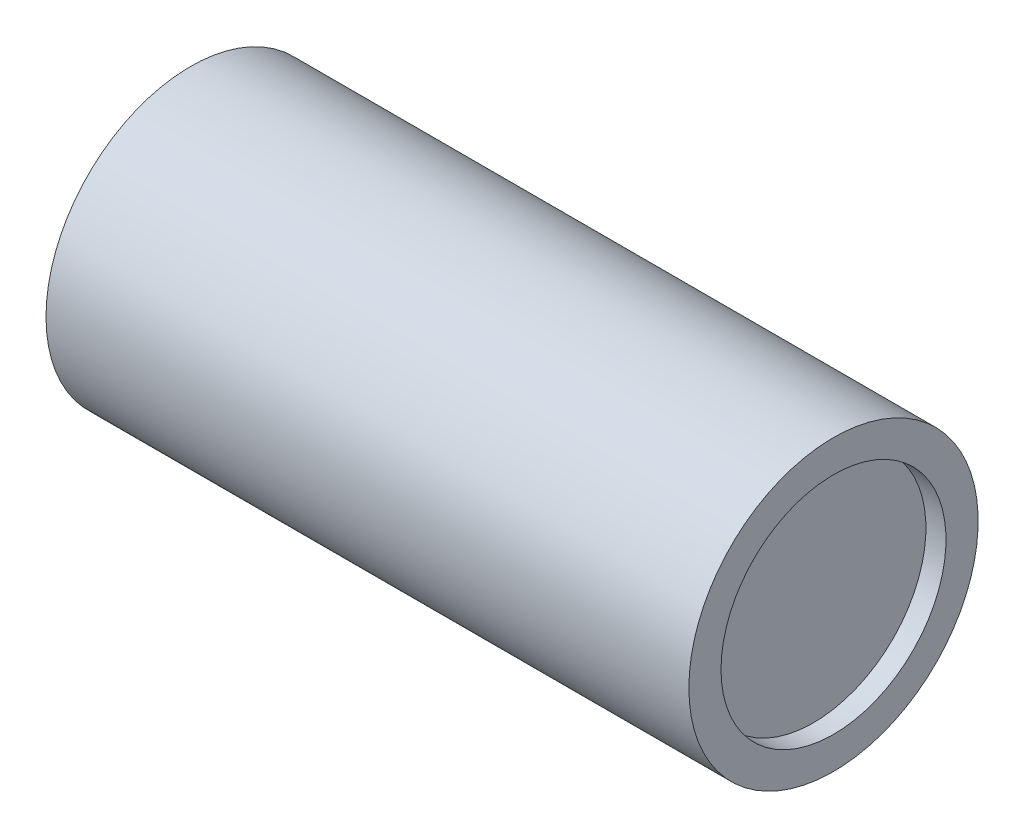
ISO-10303-21;
HEADER;
FILE_DESCRIPTION(('STEP AP214'),'2;1');
FILE_NAME('part.step','',(''),(''),'','','');
FILE_SCHEMA(('AUTOMOTIVE_DESIGN { 1 0 10303 214 1 1 1 1 }'));
ENDSEC;
DATA;
#1=APPLICATION_CONTEXT('core data for automotive mechanical design processes');
#2=APPLICATION_PROTOCOL_DEFINITION('international standard','automotive_design',2000,#1);
#3=PRODUCT_CONTEXT('',#1,'mechanical');
#4=PRODUCT('Part','Part','',(#3));
#5=PRODUCT_RELATED_PRODUCT_CATEGORY('part','',(#4));
#6=PRODUCT_DEFINITION_FORMATION('','',#4);
#7=PRODUCT_DEFINITION_CONTEXT('part definition',#1,'design');
#8=PRODUCT_DEFINITION('design','',#6,#7);
#9=PRODUCT_DEFINITION_SHAPE('','',#8);
#10=(LENGTH_UNIT() NAMED_UNIT(*) SI_UNIT(.MILLI.,.METRE.));
#11=(NAMED_UNIT(*) PLANE_ANGLE_UNIT() SI_UNIT($,.RADIAN.));
#12=(NAMED_UNIT(*) SI_UNIT($,.STERADIAN.) SOLID_ANGLE_UNIT());
#13=UNCERTAINTY_MEASURE_WITH_UNIT(LENGTH_MEASURE(1.E-05),#10,'distance_accuracy_value','');
#14=(GEOMETRIC_REPRESENTATION_CONTEXT(3) GLOBAL_UNCERTAINTY_ASSIGNED_CONTEXT((#13)) GLOBAL_UNIT_ASSIGNED_CONTEXT((#10,
#11,#12)) REPRESENTATION_CONTEXT('',''));
#15=CARTESIAN_POINT('',(0.,0.,0.));
#16=DIRECTION('',(0.,0.,1.));
#17=DIRECTION('',(1.,0.,0.));
#18=AXIS2_PLACEMENT_3D('',#15,#16,#17);
#19=CARTESIAN_POINT('',(47.625,8.89,0.));
#20=DIRECTION('',(-1.,0.,0.));
#21=DIRECTION('',(0.,0.,1.));
#22=AXIS2_PLACEMENT_3D('',#19,#20,#21);
#23=PLANE('',#22);
#24=CARTESIAN_POINT('',(47.625,0.,0.));
#25=DIRECTION('',(-1.,0.,0.));
#26=DIRECTION('',(0.,0.,1.));
#27=AXIS2_PLACEMENT_3D('',#24,#25,#26);
#28=CIRCLE('',#27,8.89);
#29=CARTESIAN_POINT('',(47.625,0.,8.89));
#30=VERTEX_POINT('',#29);
#31=EDGE_CURVE('E43',#30,#30,#28,.T.);
#32=ORIENTED_EDGE('',*,*,#31,.F.);
#33=EDGE_LOOP('',(#32));
#34=FACE_BOUND('',#33,.T.);
#35=ADVANCED_FACE('F31',(#34),#23,.F.);
#36=CARTESIAN_POINT('',(0.,0.,0.));
#37=DIRECTION('',(-1.,0.,0.));
#38=DIRECTION('',(0.,0.,1.));
#39=AXIS2_PLACEMENT_3D('',#36,#37,#38);
#40=CYLINDRICAL_SURFACE('',#39,8.89);
#41=CARTESIAN_POINT('',(49.2125,0.,0.));
#42=DIRECTION('',(-1.,0.,0.));
#43=DIRECTION('',(0.,0.,1.));
#44=AXIS2_PLACEMENT_3D('',#41,#42,#43);
#45=CIRCLE('',#44,8.89);
#46=CARTESIAN_POINT('',(49.2125,0.,8.89));
#47=VERTEX_POINT('',#46);
#48=EDGE_CURVE('E47',#47,#47,#45,.T.);
#49=ORIENTED_EDGE('',*,*,#48,.F.);
#50=EDGE_LOOP('',(#49));
#51=FACE_BOUND('',#50,.T.);
#52=ORIENTED_EDGE('',*,*,#31,.T.);
#53=EDGE_LOOP('',(#52));
#54=FACE_BOUND('',#53,.T.);
#55=ADVANCED_FACE('F88',(#51,#54),#40,.F.);
#56=CARTESIAN_POINT('',(49.2125,11.43,0.));
#57=DIRECTION('',(-1.,0.,0.));
#58=DIRECTION('',(0.,0.,1.));
#59=AXIS2_PLACEMENT_3D('',#56,#57,#58);
#60=PLANE('',#59);
#61=CARTESIAN_POINT('',(49.2125,0.,0.));
#62=DIRECTION('',(-1.,0.,0.));
#63=DIRECTION('',(0.,0.,1.));
#64=AXIS2_PLACEMENT_3D('',#61,#62,#63);
#65=CIRCLE('',#64,11.43);
#66=CARTESIAN_POINT('',(49.2125,0.,11.43));
#67=VERTEX_POINT('',#66);
#68=EDGE_CURVE('E52',#67,#67,#65,.T.);
#69=ORIENTED_EDGE('',*,*,#68,.F.);
#70=EDGE_LOOP('',(#69));
#71=FACE_BOUND('',#70,.T.);
#72=ORIENTED_EDGE('',*,*,#48,.T.);
#73=EDGE_LOOP('',(#72));
#74=FACE_BOUND('',#73,.T.);
#75=ADVANCED_FACE('F82',(#71,#74),#60,.F.);
#76=CARTESIAN_POINT('',(0.,0.,0.));
#77=DIRECTION('',(-1.,0.,0.));
#78=DIRECTION('',(0.,0.,1.));
#79=AXIS2_PLACEMENT_3D('',#76,#77,#78);
#80=CYLINDRICAL_SURFACE('',#79,11.43);
#81=CARTESIAN_POINT('',(-1.5875,0.,0.));
#82=DIRECTION('',(-1.,0.,0.));
#83=DIRECTION('',(0.,0.,1.));
#84=AXIS2_PLACEMENT_3D('',#81,#82,#83);
#85=CIRCLE('',#84,11.43);
#86=CARTESIAN_POINT('',(-1.5875,0.,11.43));
#87=VERTEX_POINT('',#86);
#88=EDGE_CURVE('E55',#87,#87,#85,.T.);
#89=ORIENTED_EDGE('',*,*,#88,.F.);
#90=EDGE_LOOP('',(#89));
#91=FACE_BOUND('',#90,.T.);
#92=ORIENTED_EDGE('',*,*,#68,.T.);
#93=EDGE_LOOP('',(#92));
#94=FACE_BOUND('',#93,.T.);
#95=ADVANCED_FACE('F76',(#91,#94),#80,.T.);
#96=CARTESIAN_POINT('',(-1.5875,8.89,0.));
#97=DIRECTION('',(1.,0.,0.));
#98=DIRECTION('',(0.,0.,-1.));
#99=AXIS2_PLACEMENT_3D('',#96,#97,#98);
#100=PLANE('',#99);
#101=CARTESIAN_POINT('',(-1.5875,0.,0.));
#102=DIRECTION('',(-1.,0.,0.));
#103=DIRECTION('',(0.,0.,1.));
#104=AXIS2_PLACEMENT_3D('',#101,#102,#103);
#105=CIRCLE('',#104,8.89);
#106=CARTESIAN_POINT('',(-1.5875,0.,8.89));
#107=VERTEX_POINT('',#106);
#108=EDGE_CURVE('E58',#107,#107,#105,.T.);
#109=ORIENTED_EDGE('',*,*,#108,.F.);
#110=EDGE_LOOP('',(#109));
#111=FACE_BOUND('',#110,.T.);
#112=ORIENTED_EDGE('',*,*,#88,.T.);
#113=EDGE_LOOP('',(#112));
#114=FACE_BOUND('',#113,.T.);
#115=ADVANCED_FACE('F70',(#111,#114),#100,.F.);
#116=CARTESIAN_POINT('',(0.,0.,0.));
#117=DIRECTION('',(-1.,0.,0.));
#118=DIRECTION('',(0.,0.,1.));
#119=AXIS2_PLACEMENT_3D('',#116,#117,#118);
#120=CYLINDRICAL_SURFACE('',#119,8.89);
#121=CARTESIAN_POINT('',(0.,0.,0.));
#122=DIRECTION('',(-1.,0.,0.));
#123=DIRECTION('',(0.,0.,1.));
#124=AXIS2_PLACEMENT_3D('',#121,#122,#123);
#125=CIRCLE('',#124,8.89);
#126=CARTESIAN_POINT('',(0.,0.,8.89));
#127=VERTEX_POINT('',#126);
#128=EDGE_CURVE('E61',#127,#127,#125,.T.);
#129=ORIENTED_EDGE('',*,*,#128,.F.);
#130=EDGE_LOOP('',(#129));
#131=FACE_BOUND('',#130,.T.);
#132=ORIENTED_EDGE('',*,*,#108,.T.);
#133=EDGE_LOOP('',(#132));
#134=FACE_BOUND('',#133,.T.);
#135=ADVANCED_FACE('F67',(#131,#134),#120,.F.);
#136=CARTESIAN_POINT('',(0.,0.,0.));
#137=DIRECTION('',(1.,0.,0.));
#138=DIRECTION('',(0.,0.,-1.));
#139=AXIS2_PLACEMENT_3D('',#136,#137,#138);
#140=PLANE('',#139);
#141=ORIENTED_EDGE('',*,*,#128,.T.);
#142=EDGE_LOOP('',(#141));
#143=FACE_BOUND('',#142,.T.);
#144=ADVANCED_FACE('F65',(#143),#140,.F.);
#145=CLOSED_SHELL('',(#35,#55,#75,#95,#115,#135,#144));
#146=CARTESIAN_POINT('',(1.5875,0.,0.));
#147=DIRECTION('',(-1.,0.,0.));
#148=DIRECTION('',(0.,0.,1.));
#149=AXIS2_PLACEMENT_3D('',#146,#147,#148);
#150=PLANE('',#149);
#151=CARTESIAN_POINT('',(1.5875,0.,0.));
#152=DIRECTION('',(-1.,0.,0.));
#153=DIRECTION('',(0.,0.,1.));
#154=AXIS2_PLACEMENT_3D('',#151,#152,#153);
#155=CIRCLE('',#154,8.89);
#156=CARTESIAN_POINT('',(1.5875,0.,8.89));
#157=VERTEX_POINT('',#156);
#158=EDGE_CURVE('E10',#157,#157,#155,.T.);
#159=ORIENTED_EDGE('',*,*,#158,.F.);
#160=EDGE_LOOP('',(#159));
#161=FACE_BOUND('',#160,.T.);
#162=ADVANCED_FACE('F33',(#161),#150,.F.);
#163=CARTESIAN_POINT('',(0.,0.,0.));
#164=DIRECTION('',(-1.,0.,0.));
#165=DIRECTION('',(0.,0.,1.));
#166=AXIS2_PLACEMENT_3D('',#163,#164,#165);
#167=CYLINDRICAL_SURFACE('',#166,8.89);
#168=CARTESIAN_POINT('',(46.0375,0.,0.));
#169=DIRECTION('',(-1.,0.,0.));
#170=DIRECTION('',(0.,0.,1.));
#171=AXIS2_PLACEMENT_3D('',#168,#169,#170);
#172=CIRCLE('',#171,8.89);
#173=CARTESIAN_POINT('',(46.0375,0.,8.89));
#174=VERTEX_POINT('',#173);
#175=EDGE_CURVE('E39',#174,#174,#172,.T.);
#176=ORIENTED_EDGE('',*,*,#175,.F.);
#177=EDGE_LOOP('',(#176));
#178=FACE_BOUND('',#177,.T.);
#179=ORIENTED_EDGE('',*,*,#158,.T.);
#180=EDGE_LOOP('',(#179));
#181=FACE_BOUND('',#180,.T.);
#182=ADVANCED_FACE('F104',(#178,#181),#167,.F.);
#183=CARTESIAN_POINT('',(46.0375,8.89,0.));
#184=DIRECTION('',(1.,0.,0.));
#185=DIRECTION('',(0.,0.,-1.));
#186=AXIS2_PLACEMENT_3D('',#183,#184,#185);
#187=PLANE('',#186);
#188=ORIENTED_EDGE('',*,*,#175,.T.);
#189=EDGE_LOOP('',(#188));
#190=FACE_BOUND('',#189,.T.);
#191=ADVANCED_FACE('F102',(#190),#187,.F.);
#192=CLOSED_SHELL('',(#162,#182,#191));
#193=ORIENTED_CLOSED_SHELL('',*,#192,.T.);
#194=BREP_WITH_VOIDS('B2',#145,(#193));
#195=ADVANCED_BREP_SHAPE_REPRESENTATION('',(#18,#194),#14);
#196=SHAPE_DEFINITION_REPRESENTATION(#9,#195);
ENDSEC;
END-ISO-10303-21;
